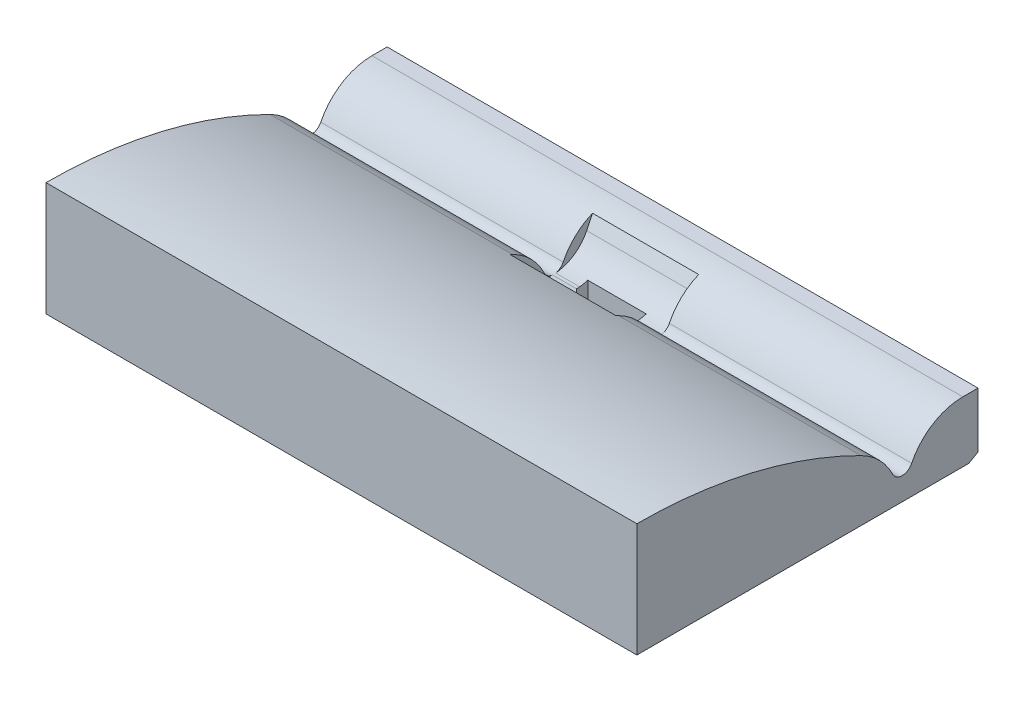
ISO-10303-21;
HEADER;
FILE_DESCRIPTION(('STEP AP214'),'2;1');
FILE_NAME('part.step','',(''),(''),'','','');
FILE_SCHEMA(('AUTOMOTIVE_DESIGN { 1 0 10303 214 1 1 1 1 }'));
ENDSEC;
DATA;
#1=APPLICATION_CONTEXT('core data for automotive mechanical design processes');
#2=APPLICATION_PROTOCOL_DEFINITION('international standard','automotive_design',2000,#1);
#3=PRODUCT_CONTEXT('',#1,'mechanical');
#4=PRODUCT('Part','Part','',(#3));
#5=PRODUCT_RELATED_PRODUCT_CATEGORY('part','',(#4));
#6=PRODUCT_DEFINITION_FORMATION('','',#4);
#7=PRODUCT_DEFINITION_CONTEXT('part definition',#1,'design');
#8=PRODUCT_DEFINITION('design','',#6,#7);
#9=PRODUCT_DEFINITION_SHAPE('','',#8);
#10=(LENGTH_UNIT() NAMED_UNIT(*) SI_UNIT(.MILLI.,.METRE.));
#11=(NAMED_UNIT(*) PLANE_ANGLE_UNIT() SI_UNIT($,.RADIAN.));
#12=(NAMED_UNIT(*) SI_UNIT($,.STERADIAN.) SOLID_ANGLE_UNIT());
#13=UNCERTAINTY_MEASURE_WITH_UNIT(LENGTH_MEASURE(1.E-05),#10,'distance_accuracy_value','');
#14=(GEOMETRIC_REPRESENTATION_CONTEXT(3) GLOBAL_UNCERTAINTY_ASSIGNED_CONTEXT((#13)) GLOBAL_UNIT_ASSIGNED_CONTEXT((#10,
#11,#12)) REPRESENTATION_CONTEXT('',''));
#15=CARTESIAN_POINT('',(0.,0.,0.));
#16=DIRECTION('',(0.,0.,1.));
#17=DIRECTION('',(1.,0.,0.));
#18=AXIS2_PLACEMENT_3D('',#15,#16,#17);
#19=CARTESIAN_POINT('',(38.9711431702997,52.2246829705794,19.5711631372731));
#20=DIRECTION('',(-1.,0.,0.));
#21=DIRECTION('',(0.,0.,1.));
#22=AXIS2_PLACEMENT_3D('',#19,#20,#21);
#23=CYLINDRICAL_SURFACE('',#22,9.25729399021629);
#24=CARTESIAN_POINT('',(7.,52.2246829705794,19.5711631372731));
#25=DIRECTION('',(-1.,0.,0.));
#26=DIRECTION('',(0.,0.,1.));
#27=AXIS2_PLACEMENT_3D('',#24,#25,#26);
#28=CIRCLE('',#27,9.25729399021629);
#29=CARTESIAN_POINT('',(7.,60.5,15.4218716213784));
#30=VERTEX_POINT('',#29);
#31=CARTESIAN_POINT('',(7.,56.28125,11.25));
#32=VERTEX_POINT('',#31);
#33=EDGE_CURVE('E261',#30,#32,#28,.T.);
#34=ORIENTED_EDGE('',*,*,#33,.F.);
#35=DIRECTION('',(-1.,0.,0.));
#36=VECTOR('',#35,1.);
#37=CARTESIAN_POINT('',(38.9711431702997,60.5,15.4218716213784));
#38=LINE('',#37,#36);
#39=CARTESIAN_POINT('',(38.9711431702997,60.5,15.4218716213784));
#40=VERTEX_POINT('',#39);
#41=EDGE_CURVE('E372',#40,#30,#38,.T.);
#42=ORIENTED_EDGE('',*,*,#41,.F.);
#43=CARTESIAN_POINT('',(38.9711431702997,52.2246829705794,19.5711631372731));
#44=DIRECTION('',(1.,0.,0.));
#45=DIRECTION('',(0.,0.,1.));
#46=AXIS2_PLACEMENT_3D('',#43,#44,#45);
#47=CIRCLE('',#46,9.25729399021629);
#48=CARTESIAN_POINT('',(38.9711431702997,56.28125,11.25));
#49=VERTEX_POINT('',#48);
#50=EDGE_CURVE('E353',#49,#40,#47,.T.);
#51=ORIENTED_EDGE('',*,*,#50,.F.);
#52=DIRECTION('',(-1.,0.,0.));
#53=VECTOR('',#52,1.);
#54=CARTESIAN_POINT('',(38.9711431702997,56.28125,11.25));
#55=LINE('',#54,#53);
#56=EDGE_CURVE('E376',#49,#32,#55,.T.);
#57=ORIENTED_EDGE('',*,*,#56,.T.);
#58=EDGE_LOOP('',(#34,#42,#51,#57));
#59=FACE_BOUND('',#58,.T.);
#60=ADVANCED_FACE('F37',(#59),#23,.T.);
#61=CARTESIAN_POINT('',(38.9711431702997,56.890625,10.));
#62=DIRECTION('',(-1.,0.,0.));
#63=DIRECTION('',(0.,0.,1.));
#64=AXIS2_PLACEMENT_3D('',#61,#62,#63);
#65=CYLINDRICAL_SURFACE('',#64,1.390625);
#66=CARTESIAN_POINT('',(7.,56.890625,10.));
#67=DIRECTION('',(-1.,0.,0.));
#68=DIRECTION('',(0.,0.,1.));
#69=AXIS2_PLACEMENT_3D('',#66,#67,#68);
#70=CIRCLE('',#69,1.390625);
#71=CARTESIAN_POINT('',(7.,55.5252776994791,9.73605940140772));
#72=VERTEX_POINT('',#71);
#73=CARTESIAN_POINT('',(7.,56.28125,8.75));
#74=VERTEX_POINT('',#73);
#75=EDGE_CURVE('E266',#72,#74,#70,.F.);
#76=ORIENTED_EDGE('',*,*,#75,.F.);
#77=DIRECTION('',(1.,0.,0.));
#78=VECTOR('',#77,1.);
#79=CARTESIAN_POINT('',(0.,55.5252776994791,9.73605940140772));
#80=LINE('',#79,#78);
#81=CARTESIAN_POINT('',(3.85,55.5252776994791,9.73605940140772));
#82=VERTEX_POINT('',#81);
#83=EDGE_CURVE('E246',#72,#82,#80,.F.);
#84=ORIENTED_EDGE('',*,*,#83,.T.);
#85=CARTESIAN_POINT('',(3.85,56.890625,10.));
#86=DIRECTION('',(1.,0.,0.));
#87=DIRECTION('',(0.,0.,-1.));
#88=AXIS2_PLACEMENT_3D('',#85,#86,#87);
#89=CIRCLE('',#88,1.390625);
#90=CARTESIAN_POINT('',(3.85,55.5081135567833,10.15));
#91=VERTEX_POINT('',#90);
#92=EDGE_CURVE('E290',#91,#82,#89,.T.);
#93=ORIENTED_EDGE('',*,*,#92,.F.);
#94=DIRECTION('',(1.,0.,0.));
#95=VECTOR('',#94,1.);
#96=CARTESIAN_POINT('',(0.,55.5081135567833,10.15));
#97=LINE('',#96,#95);
#98=CARTESIAN_POINT('',(7.,55.5081135567833,10.15));
#99=VERTEX_POINT('',#98);
#100=EDGE_CURVE('E258',#91,#99,#97,.T.);
#101=ORIENTED_EDGE('',*,*,#100,.T.);
#102=EDGE_CURVE('E263',#32,#99,#70,.F.);
#103=ORIENTED_EDGE('',*,*,#102,.F.);
#104=ORIENTED_EDGE('',*,*,#56,.F.);
#105=CARTESIAN_POINT('',(38.9711431702997,56.890625,10.));
#106=DIRECTION('',(-1.,0.,0.));
#107=DIRECTION('',(0.,0.,-1.));
#108=AXIS2_PLACEMENT_3D('',#105,#106,#107);
#109=CIRCLE('',#108,1.390625);
#110=CARTESIAN_POINT('',(38.9711431702997,56.28125,8.75));
#111=VERTEX_POINT('',#110);
#112=EDGE_CURVE('E351',#111,#49,#109,.T.);
#113=ORIENTED_EDGE('',*,*,#112,.F.);
#114=DIRECTION('',(-1.,0.,0.));
#115=VECTOR('',#114,1.);
#116=CARTESIAN_POINT('',(38.9711431702997,56.28125,8.75));
#117=LINE('',#116,#115);
#118=EDGE_CURVE('E380',#111,#74,#117,.T.);
#119=ORIENTED_EDGE('',*,*,#118,.T.);
#120=EDGE_LOOP('',(#76,#84,#93,#101,#103,#104,#113,#119));
#121=FACE_BOUND('',#120,.T.);
#122=ADVANCED_FACE('F456',(#121),#65,.F.);
#123=CARTESIAN_POINT('',(38.9711431702997,53.2,0.));
#124=DIRECTION('',(0.,0.,1.));
#125=DIRECTION('',(1.,0.,0.));
#126=AXIS2_PLACEMENT_3D('',#123,#124,#125);
#127=PLANE('',#126);
#128=DIRECTION('',(-1.,0.,0.));
#129=VECTOR('',#128,1.);
#130=CARTESIAN_POINT('',(38.9711431702997,53.2,0.));
#131=LINE('',#130,#129);
#132=CARTESIAN_POINT('',(38.9711431702997,53.2,0.));
#133=VERTEX_POINT('',#132);
#134=CARTESIAN_POINT('',(-38.9711431702997,53.2,0.));
#135=VERTEX_POINT('',#134);
#136=EDGE_CURVE('E363',#133,#135,#131,.T.);
#137=ORIENTED_EDGE('',*,*,#136,.T.);
#138=DIRECTION('',(0.,1.,0.));
#139=VECTOR('',#138,1.);
#140=CARTESIAN_POINT('',(-38.9711431702997,53.2,0.));
#141=LINE('',#140,#139);
#142=CARTESIAN_POINT('',(-38.9711431702997,60.5,0.));
#143=VERTEX_POINT('',#142);
#144=EDGE_CURVE('E317',#135,#143,#141,.T.);
#145=ORIENTED_EDGE('',*,*,#144,.T.);
#146=DIRECTION('',(-1.,0.,0.));
#147=VECTOR('',#146,1.);
#148=CARTESIAN_POINT('',(38.9711431702997,60.5,0.));
#149=LINE('',#148,#147);
#150=CARTESIAN_POINT('',(38.9711431702997,60.5,0.));
#151=VERTEX_POINT('',#150);
#152=EDGE_CURVE('E385',#151,#143,#149,.T.);
#153=ORIENTED_EDGE('',*,*,#152,.F.);
#154=DIRECTION('',(0.,1.,0.));
#155=VECTOR('',#154,1.);
#156=CARTESIAN_POINT('',(38.9711431702997,53.2,0.));
#157=LINE('',#156,#155);
#158=EDGE_CURVE('E344',#133,#151,#157,.T.);
#159=ORIENTED_EDGE('',*,*,#158,.F.);
#160=EDGE_LOOP('',(#137,#145,#153,#159));
#161=FACE_BOUND('',#160,.T.);
#162=ADVANCED_FACE('F39',(#161),#127,.F.);
#163=CARTESIAN_POINT('',(38.9711431702997,60.5,0.));
#164=DIRECTION('',(0.,-1.,0.));
#165=DIRECTION('',(0.,0.,-1.));
#166=AXIS2_PLACEMENT_3D('',#163,#164,#165);
#167=PLANE('',#166);
#168=ORIENTED_EDGE('',*,*,#152,.T.);
#169=DIRECTION('',(0.,0.,1.));
#170=VECTOR('',#169,1.);
#171=CARTESIAN_POINT('',(-38.9711431702997,60.5,0.));
#172=LINE('',#171,#170);
#173=CARTESIAN_POINT('',(-38.9711431702997,60.5,2.));
#174=VERTEX_POINT('',#173);
#175=EDGE_CURVE('E320',#143,#174,#172,.T.);
#176=ORIENTED_EDGE('',*,*,#175,.T.);
#177=DIRECTION('',(-1.,0.,0.));
#178=VECTOR('',#177,1.);
#179=CARTESIAN_POINT('',(38.9711431702997,60.5,2.));
#180=LINE('',#179,#178);
#181=CARTESIAN_POINT('',(38.9711431702997,60.5,2.));
#182=VERTEX_POINT('',#181);
#183=EDGE_CURVE('E383',#182,#174,#180,.T.);
#184=ORIENTED_EDGE('',*,*,#183,.F.);
#185=DIRECTION('',(0.,0.,1.));
#186=VECTOR('',#185,1.);
#187=CARTESIAN_POINT('',(38.9711431702997,60.5,0.));
#188=LINE('',#187,#186);
#189=EDGE_CURVE('E347',#151,#182,#188,.T.);
#190=ORIENTED_EDGE('',*,*,#189,.F.);
#191=EDGE_LOOP('',(#168,#176,#184,#190));
#192=FACE_BOUND('',#191,.T.);
#193=ADVANCED_FACE('F421',(#192),#167,.F.);
#194=CARTESIAN_POINT('',(38.9711431702997,52.990625,2.));
#195=DIRECTION('',(-1.,0.,0.));
#196=DIRECTION('',(0.,0.,1.));
#197=AXIS2_PLACEMENT_3D('',#194,#195,#196);
#198=CYLINDRICAL_SURFACE('',#197,7.509375);
#199=CARTESIAN_POINT('',(-7.,56.28125,8.75));
#200=VERTEX_POINT('',#199);
#201=CARTESIAN_POINT('',(-38.9711431702997,56.28125,8.75));
#202=VERTEX_POINT('',#201);
#203=EDGE_CURVE('E379',#200,#202,#117,.T.);
#204=ORIENTED_EDGE('',*,*,#203,.F.);
#205=CARTESIAN_POINT('',(-7.,52.990625,2.));
#206=DIRECTION('',(-1.,0.,0.));
#207=DIRECTION('',(0.,0.,1.));
#208=AXIS2_PLACEMENT_3D('',#205,#206,#207);
#209=CIRCLE('',#208,7.509375);
#210=CARTESIAN_POINT('',(-7.,59.9276013910904,4.87559931841684));
#211=VERTEX_POINT('',#210);
#212=EDGE_CURVE('E274',#200,#211,#209,.T.);
#213=ORIENTED_EDGE('',*,*,#212,.T.);
#214=DIRECTION('',(-1.,0.,0.));
#215=VECTOR('',#214,1.);
#216=CARTESIAN_POINT('',(38.9711431702997,59.9276013910904,4.87559931841684));
#217=LINE('',#216,#215);
#218=CARTESIAN_POINT('',(7.,59.9276013910904,4.87559931841684));
#219=VERTEX_POINT('',#218);
#220=EDGE_CURVE('E11',#211,#219,#217,.F.);
#221=ORIENTED_EDGE('',*,*,#220,.T.);
#222=CARTESIAN_POINT('',(7.,52.990625,2.));
#223=DIRECTION('',(-1.,0.,0.));
#224=DIRECTION('',(0.,0.,1.));
#225=AXIS2_PLACEMENT_3D('',#222,#223,#224);
#226=CIRCLE('',#225,7.509375);
#227=EDGE_CURVE('E265',#74,#219,#226,.T.);
#228=ORIENTED_EDGE('',*,*,#227,.F.);
#229=ORIENTED_EDGE('',*,*,#118,.F.);
#230=CARTESIAN_POINT('',(38.9711431702997,52.990625,2.));
#231=DIRECTION('',(1.,0.,0.));
#232=DIRECTION('',(0.,0.,1.));
#233=AXIS2_PLACEMENT_3D('',#230,#231,#232);
#234=CIRCLE('',#233,7.509375);
#235=EDGE_CURVE('E349',#182,#111,#234,.T.);
#236=ORIENTED_EDGE('',*,*,#235,.F.);
#237=ORIENTED_EDGE('',*,*,#183,.T.);
#238=CARTESIAN_POINT('',(-38.9711431702997,52.990625,2.));
#239=DIRECTION('',(1.,0.,0.));
#240=DIRECTION('',(0.,0.,1.));
#241=AXIS2_PLACEMENT_3D('',#238,#239,#240);
#242=CIRCLE('',#241,7.509375);
#243=EDGE_CURVE('E323',#174,#202,#242,.T.);
#244=ORIENTED_EDGE('',*,*,#243,.T.);
#245=EDGE_LOOP('',(#204,#213,#221,#228,#229,#236,#237,#244));
#246=FACE_BOUND('',#245,.T.);
#247=ADVANCED_FACE('F416',(#246),#198,.T.);
#248=CARTESIAN_POINT('',(-3.85,56.890625,10.));
#249=DIRECTION('',(-1.,0.,0.));
#250=DIRECTION('',(0.,0.,1.));
#251=AXIS2_PLACEMENT_3D('',#248,#249,#250);
#252=CIRCLE('',#251,1.390625);
#253=CARTESIAN_POINT('',(-3.85,55.5252776994791,9.73605940140772));
#254=VERTEX_POINT('',#253);
#255=CARTESIAN_POINT('',(-3.85,55.5081135567833,10.15));
#256=VERTEX_POINT('',#255);
#257=EDGE_CURVE('E314',#254,#256,#252,.T.);
#258=ORIENTED_EDGE('',*,*,#257,.F.);
#259=DIRECTION('',(1.,0.,0.));
#260=VECTOR('',#259,1.);
#261=CARTESIAN_POINT('',(0.,55.5252776994791,9.73605940140772));
#262=LINE('',#261,#260);
#263=CARTESIAN_POINT('',(-7.,55.5252776994791,9.73605940140772));
#264=VERTEX_POINT('',#263);
#265=EDGE_CURVE('E244',#254,#264,#262,.F.);
#266=ORIENTED_EDGE('',*,*,#265,.T.);
#267=CARTESIAN_POINT('',(-7.,56.890625,10.));
#268=DIRECTION('',(-1.,0.,0.));
#269=DIRECTION('',(0.,0.,1.));
#270=AXIS2_PLACEMENT_3D('',#267,#268,#269);
#271=CIRCLE('',#270,1.390625);
#272=EDGE_CURVE('E211',#264,#200,#271,.F.);
#273=ORIENTED_EDGE('',*,*,#272,.T.);
#274=ORIENTED_EDGE('',*,*,#203,.T.);
#275=CARTESIAN_POINT('',(-38.9711431702997,56.890625,10.));
#276=DIRECTION('',(-1.,0.,0.));
#277=DIRECTION('',(0.,0.,-1.));
#278=AXIS2_PLACEMENT_3D('',#275,#276,#277);
#279=CIRCLE('',#278,1.390625);
#280=CARTESIAN_POINT('',(-38.9711431702997,56.28125,11.25));
#281=VERTEX_POINT('',#280);
#282=EDGE_CURVE('E326',#202,#281,#279,.T.);
#283=ORIENTED_EDGE('',*,*,#282,.T.);
#284=CARTESIAN_POINT('',(-7.,56.28125,11.25));
#285=VERTEX_POINT('',#284);
#286=EDGE_CURVE('E375',#285,#281,#55,.T.);
#287=ORIENTED_EDGE('',*,*,#286,.F.);
#288=CARTESIAN_POINT('',(-7.,55.5081135567833,10.15));
#289=VERTEX_POINT('',#288);
#290=EDGE_CURVE('E271',#285,#289,#271,.F.);
#291=ORIENTED_EDGE('',*,*,#290,.T.);
#292=DIRECTION('',(1.,0.,0.));
#293=VECTOR('',#292,1.);
#294=CARTESIAN_POINT('',(0.,55.5081135567833,10.15));
#295=LINE('',#294,#293);
#296=EDGE_CURVE('E255',#289,#256,#295,.T.);
#297=ORIENTED_EDGE('',*,*,#296,.T.);
#298=EDGE_LOOP('',(#258,#266,#273,#274,#283,#287,#291,#297));
#299=FACE_BOUND('',#298,.T.);
#300=ADVANCED_FACE('F413',(#299),#65,.F.);
#301=CARTESIAN_POINT('',(-7.,60.5,15.4218716213784));
#302=VERTEX_POINT('',#301);
#303=CARTESIAN_POINT('',(-38.9711431702997,60.5,15.4218716213784));
#304=VERTEX_POINT('',#303);
#305=EDGE_CURVE('E371',#302,#304,#38,.T.);
#306=ORIENTED_EDGE('',*,*,#305,.F.);
#307=CARTESIAN_POINT('',(-7.,52.2246829705794,19.5711631372731));
#308=DIRECTION('',(-1.,0.,0.));
#309=DIRECTION('',(0.,0.,1.));
#310=AXIS2_PLACEMENT_3D('',#307,#308,#309);
#311=CIRCLE('',#310,9.25729399021629);
#312=EDGE_CURVE('E268',#302,#285,#311,.T.);
#313=ORIENTED_EDGE('',*,*,#312,.T.);
#314=ORIENTED_EDGE('',*,*,#286,.T.);
#315=CARTESIAN_POINT('',(-38.9711431702997,52.2246829705794,19.5711631372731));
#316=DIRECTION('',(1.,0.,0.));
#317=DIRECTION('',(0.,0.,1.));
#318=AXIS2_PLACEMENT_3D('',#315,#316,#317);
#319=CIRCLE('',#318,9.25729399021629);
#320=EDGE_CURVE('E329',#281,#304,#319,.T.);
#321=ORIENTED_EDGE('',*,*,#320,.T.);
#322=EDGE_LOOP('',(#306,#313,#314,#321));
#323=FACE_BOUND('',#322,.T.);
#324=ADVANCED_FACE('F402',(#323),#23,.T.);
#325=CARTESIAN_POINT('',(38.9711431702997,1.50959440127008,45.));
#326=DIRECTION('',(-1.,0.,0.));
#327=DIRECTION('',(0.,0.,1.));
#328=AXIS2_PLACEMENT_3D('',#325,#326,#327);
#329=CYLINDRICAL_SURFACE('',#328,65.99040559873);
#330=DIRECTION('',(-1.,0.,0.));
#331=VECTOR('',#330,1.);
#332=CARTESIAN_POINT('',(38.9711431702997,60.683362123709,15.7904323103588));
#333=LINE('',#332,#331);
#334=CARTESIAN_POINT('',(7.,60.6833621237091,15.7904323103588));
#335=VERTEX_POINT('',#334);
#336=CARTESIAN_POINT('',(-7.,60.6833621237091,15.7904323103588));
#337=VERTEX_POINT('',#336);
#338=EDGE_CURVE('E391',#335,#337,#333,.T.);
#339=ORIENTED_EDGE('',*,*,#338,.T.);
#340=CARTESIAN_POINT('',(-7.,1.50959440127008,45.));
#341=DIRECTION('',(-1.,0.,0.));
#342=DIRECTION('',(0.,0.,1.));
#343=AXIS2_PLACEMENT_3D('',#340,#341,#342);
#344=CIRCLE('',#343,65.99040559873);
#345=EDGE_CURVE('E45',#337,#302,#344,.T.);
#346=ORIENTED_EDGE('',*,*,#345,.T.);
#347=ORIENTED_EDGE('',*,*,#305,.T.);
#348=CARTESIAN_POINT('',(-38.9711431702997,1.50959440127008,45.));
#349=DIRECTION('',(1.,0.,0.));
#350=DIRECTION('',(0.,0.,-1.));
#351=AXIS2_PLACEMENT_3D('',#348,#349,#350);
#352=CIRCLE('',#351,65.99040559873);
#353=CARTESIAN_POINT('',(-38.9711431702997,67.5,45.));
#354=VERTEX_POINT('',#353);
#355=EDGE_CURVE('E332',#304,#354,#352,.T.);
#356=ORIENTED_EDGE('',*,*,#355,.T.);
#357=DIRECTION('',(-1.,0.,0.));
#358=VECTOR('',#357,1.);
#359=CARTESIAN_POINT('',(38.9711431702997,67.5,45.));
#360=LINE('',#359,#358);
#361=CARTESIAN_POINT('',(38.9711431702997,67.5,45.));
#362=VERTEX_POINT('',#361);
#363=EDGE_CURVE('E369',#362,#354,#360,.T.);
#364=ORIENTED_EDGE('',*,*,#363,.F.);
#365=CARTESIAN_POINT('',(38.9711431702997,1.50959440127008,45.));
#366=DIRECTION('',(1.,0.,0.));
#367=DIRECTION('',(0.,0.,-1.));
#368=AXIS2_PLACEMENT_3D('',#365,#366,#367);
#369=CIRCLE('',#368,65.99040559873);
#370=EDGE_CURVE('E355',#40,#362,#369,.T.);
#371=ORIENTED_EDGE('',*,*,#370,.F.);
#372=ORIENTED_EDGE('',*,*,#41,.T.);
#373=CARTESIAN_POINT('',(7.,1.50959440127008,45.));
#374=DIRECTION('',(-1.,0.,0.));
#375=DIRECTION('',(0.,0.,1.));
#376=AXIS2_PLACEMENT_3D('',#373,#374,#375);
#377=CIRCLE('',#376,65.99040559873);
#378=EDGE_CURVE('E389',#335,#30,#377,.T.);
#379=ORIENTED_EDGE('',*,*,#378,.F.);
#380=EDGE_LOOP('',(#339,#346,#347,#356,#364,#371,#372,#379));
#381=FACE_BOUND('',#380,.T.);
#382=ADVANCED_FACE('F396',(#381),#329,.T.);
#383=CARTESIAN_POINT('',(38.9711431702997,67.5,45.));
#384=DIRECTION('',(0.,0.,-1.));
#385=DIRECTION('',(-1.,0.,0.));
#386=AXIS2_PLACEMENT_3D('',#383,#384,#385);
#387=PLANE('',#386);
#388=ORIENTED_EDGE('',*,*,#363,.T.);
#389=DIRECTION('',(0.,-1.,0.));
#390=VECTOR('',#389,1.);
#391=CARTESIAN_POINT('',(-38.9711431702997,67.5,45.));
#392=LINE('',#391,#390);
#393=CARTESIAN_POINT('',(-38.9711431702997,52.5,45.));
#394=VERTEX_POINT('',#393);
#395=EDGE_CURVE('E335',#354,#394,#392,.T.);
#396=ORIENTED_EDGE('',*,*,#395,.T.);
#397=DIRECTION('',(-1.,0.,0.));
#398=VECTOR('',#397,1.);
#399=CARTESIAN_POINT('',(38.9711431702997,52.5,45.));
#400=LINE('',#399,#398);
#401=CARTESIAN_POINT('',(38.9711431702997,52.5,45.));
#402=VERTEX_POINT('',#401);
#403=EDGE_CURVE('E367',#402,#394,#400,.T.);
#404=ORIENTED_EDGE('',*,*,#403,.F.);
#405=DIRECTION('',(0.,-1.,0.));
#406=VECTOR('',#405,1.);
#407=CARTESIAN_POINT('',(38.9711431702997,67.5,45.));
#408=LINE('',#407,#406);
#409=EDGE_CURVE('E357',#362,#402,#408,.T.);
#410=ORIENTED_EDGE('',*,*,#409,.F.);
#411=EDGE_LOOP('',(#388,#396,#404,#410));
#412=FACE_BOUND('',#411,.T.);
#413=ADVANCED_FACE('F437',(#412),#387,.F.);
#414=CARTESIAN_POINT('',(38.9711431702997,52.5,1.2124355652982));
#415=DIRECTION('',(0.,1.,0.));
#416=DIRECTION('',(0.,0.,1.));
#417=AXIS2_PLACEMENT_3D('',#414,#415,#416);
#418=PLANE('',#417);
#419=DIRECTION('',(-0.707106781186548,0.,0.707106781186547));
#420=VECTOR('',#419,1.);
#421=CARTESIAN_POINT('',(3.85,52.5,10.15));
#422=LINE('',#421,#420);
#423=CARTESIAN_POINT('',(3.85,52.5,10.15));
#424=VERTEX_POINT('',#423);
#425=CARTESIAN_POINT('',(2.65,52.5,11.35));
#426=VERTEX_POINT('',#425);
#427=EDGE_CURVE('E284',#424,#426,#422,.T.);
#428=ORIENTED_EDGE('',*,*,#427,.F.);
#429=DIRECTION('',(0.,0.,1.));
#430=VECTOR('',#429,1.);
#431=CARTESIAN_POINT('',(3.85,52.5,8.65000000000001));
#432=LINE('',#431,#430);
#433=CARTESIAN_POINT('',(3.85,52.5,8.65000000000001));
#434=VERTEX_POINT('',#433);
#435=EDGE_CURVE('E287',#434,#424,#432,.T.);
#436=ORIENTED_EDGE('',*,*,#435,.F.);
#437=DIRECTION('',(1.,0.,0.));
#438=VECTOR('',#437,1.);
#439=CARTESIAN_POINT('',(3.85,52.5,8.65000000000001));
#440=LINE('',#439,#438);
#441=CARTESIAN_POINT('',(-3.85,52.5,8.65000000000001));
#442=VERTEX_POINT('',#441);
#443=EDGE_CURVE('E297',#442,#434,#440,.T.);
#444=ORIENTED_EDGE('',*,*,#443,.F.);
#445=DIRECTION('',(0.,0.,-1.));
#446=VECTOR('',#445,1.);
#447=CARTESIAN_POINT('',(-3.85,52.5,8.65000000000001));
#448=LINE('',#447,#446);
#449=CARTESIAN_POINT('',(-3.85,52.5,10.15));
#450=VERTEX_POINT('',#449);
#451=EDGE_CURVE('E276',#450,#442,#448,.T.);
#452=ORIENTED_EDGE('',*,*,#451,.F.);
#453=DIRECTION('',(-0.707106781186549,0.,-0.707106781186546));
#454=VECTOR('',#453,1.);
#455=CARTESIAN_POINT('',(-2.65,52.5,11.35));
#456=LINE('',#455,#454);
#457=CARTESIAN_POINT('',(-2.65,52.5,11.35));
#458=VERTEX_POINT('',#457);
#459=EDGE_CURVE('E278',#458,#450,#456,.T.);
#460=ORIENTED_EDGE('',*,*,#459,.F.);
#461=DIRECTION('',(-1.,0.,0.));
#462=VECTOR('',#461,1.);
#463=CARTESIAN_POINT('',(2.65,52.5,11.35));
#464=LINE('',#463,#462);
#465=EDGE_CURVE('E281',#426,#458,#464,.T.);
#466=ORIENTED_EDGE('',*,*,#465,.F.);
#467=EDGE_LOOP('',(#428,#436,#444,#452,#460,#466));
#468=FACE_BOUND('',#467,.T.);
#469=ORIENTED_EDGE('',*,*,#403,.T.);
#470=DIRECTION('',(0.,0.,-1.));
#471=VECTOR('',#470,1.);
#472=CARTESIAN_POINT('',(-38.9711431702997,52.5,1.2124355652982));
#473=LINE('',#472,#471);
#474=CARTESIAN_POINT('',(-38.9711431702997,52.5,1.2124355652982));
#475=VERTEX_POINT('',#474);
#476=EDGE_CURVE('E338',#394,#475,#473,.T.);
#477=ORIENTED_EDGE('',*,*,#476,.T.);
#478=DIRECTION('',(-1.,0.,0.));
#479=VECTOR('',#478,1.);
#480=CARTESIAN_POINT('',(38.9711431702997,52.5,1.2124355652982));
#481=LINE('',#480,#479);
#482=CARTESIAN_POINT('',(38.9711431702997,52.5,1.2124355652982));
#483=VERTEX_POINT('',#482);
#484=EDGE_CURVE('E365',#483,#475,#481,.T.);
#485=ORIENTED_EDGE('',*,*,#484,.F.);
#486=DIRECTION('',(0.,0.,-1.));
#487=VECTOR('',#486,1.);
#488=CARTESIAN_POINT('',(38.9711431702997,52.5,1.2124355652982));
#489=LINE('',#488,#487);
#490=EDGE_CURVE('E359',#402,#483,#489,.T.);
#491=ORIENTED_EDGE('',*,*,#490,.F.);
#492=EDGE_LOOP('',(#469,#477,#485,#491));
#493=FACE_BOUND('',#492,.T.);
#494=ADVANCED_FACE('F434',(#468,#493),#418,.F.);
#495=CARTESIAN_POINT('',(38.9711431702997,53.2,0.));
#496=DIRECTION('',(0.,0.866025403784436,0.500000000000004));
#497=DIRECTION('',(0.,-0.500000000000004,0.866025403784436));
#498=AXIS2_PLACEMENT_3D('',#495,#496,#497);
#499=PLANE('',#498);
#500=ORIENTED_EDGE('',*,*,#484,.T.);
#501=DIRECTION('',(0.,0.500000000000004,-0.866025403784436));
#502=VECTOR('',#501,1.);
#503=CARTESIAN_POINT('',(-38.9711431702997,53.2,0.));
#504=LINE('',#503,#502);
#505=EDGE_CURVE('E341',#475,#135,#504,.T.);
#506=ORIENTED_EDGE('',*,*,#505,.T.);
#507=ORIENTED_EDGE('',*,*,#136,.F.);
#508=DIRECTION('',(0.,0.500000000000004,-0.866025403784436));
#509=VECTOR('',#508,1.);
#510=CARTESIAN_POINT('',(38.9711431702997,53.2,0.));
#511=LINE('',#510,#509);
#512=EDGE_CURVE('E361',#483,#133,#511,.T.);
#513=ORIENTED_EDGE('',*,*,#512,.F.);
#514=EDGE_LOOP('',(#500,#506,#507,#513));
#515=FACE_BOUND('',#514,.T.);
#516=ADVANCED_FACE('F429',(#515),#499,.F.);
#517=CARTESIAN_POINT('',(38.9711431702997,52.990625,2.));
#518=DIRECTION('',(-1.,0.,0.));
#519=DIRECTION('',(0.,0.,1.));
#520=AXIS2_PLACEMENT_3D('',#517,#518,#519);
#521=PLANE('',#520);
#522=ORIENTED_EDGE('',*,*,#158,.T.);
#523=ORIENTED_EDGE('',*,*,#189,.T.);
#524=ORIENTED_EDGE('',*,*,#235,.T.);
#525=ORIENTED_EDGE('',*,*,#112,.T.);
#526=ORIENTED_EDGE('',*,*,#50,.T.);
#527=ORIENTED_EDGE('',*,*,#370,.T.);
#528=ORIENTED_EDGE('',*,*,#409,.T.);
#529=ORIENTED_EDGE('',*,*,#490,.T.);
#530=ORIENTED_EDGE('',*,*,#512,.T.);
#531=EDGE_LOOP('',(#522,#523,#524,#525,#526,#527,#528,#529,#530));
#532=FACE_BOUND('',#531,.T.);
#533=ADVANCED_FACE('F443',(#532),#521,.F.);
#534=CARTESIAN_POINT('',(-38.9711431702997,52.990625,2.));
#535=DIRECTION('',(-1.,0.,0.));
#536=DIRECTION('',(0.,0.,1.));
#537=AXIS2_PLACEMENT_3D('',#534,#535,#536);
#538=PLANE('',#537);
#539=ORIENTED_EDGE('',*,*,#144,.F.);
#540=ORIENTED_EDGE('',*,*,#505,.F.);
#541=ORIENTED_EDGE('',*,*,#476,.F.);
#542=ORIENTED_EDGE('',*,*,#395,.F.);
#543=ORIENTED_EDGE('',*,*,#355,.F.);
#544=ORIENTED_EDGE('',*,*,#320,.F.);
#545=ORIENTED_EDGE('',*,*,#282,.F.);
#546=ORIENTED_EDGE('',*,*,#243,.F.);
#547=ORIENTED_EDGE('',*,*,#175,.F.);
#548=EDGE_LOOP('',(#539,#540,#541,#542,#543,#544,#545,#546,#547));
#549=FACE_BOUND('',#548,.T.);
#550=ADVANCED_FACE('F408',(#549),#538,.T.);
#551=CARTESIAN_POINT('',(3.85,52.499,8.65000000000001));
#552=DIRECTION('',(1.,0.,0.));
#553=DIRECTION('',(0.,0.,-1.));
#554=AXIS2_PLACEMENT_3D('',#551,#552,#553);
#555=PLANE('',#554);
#556=ORIENTED_EDGE('',*,*,#92,.T.);
#557=CARTESIAN_POINT('',(3.85,60.5081135567833,10.15));
#558=DIRECTION('',(1.,0.,0.));
#559=DIRECTION('',(0.,0.,-1.));
#560=AXIS2_PLACEMENT_3D('',#557,#558,#559);
#561=CIRCLE('',#560,5.);
#562=CARTESIAN_POINT('',(3.85,55.7384175496986,8.65000000000001));
#563=VERTEX_POINT('',#562);
#564=EDGE_CURVE('E241',#82,#563,#561,.T.);
#565=ORIENTED_EDGE('',*,*,#564,.T.);
#566=DIRECTION('',(0.,1.,0.));
#567=VECTOR('',#566,1.);
#568=CARTESIAN_POINT('',(3.85,52.499,8.65000000000001));
#569=LINE('',#568,#567);
#570=EDGE_CURVE('E293',#434,#563,#569,.T.);
#571=ORIENTED_EDGE('',*,*,#570,.F.);
#572=ORIENTED_EDGE('',*,*,#435,.T.);
#573=DIRECTION('',(0.,1.,0.));
#574=VECTOR('',#573,1.);
#575=CARTESIAN_POINT('',(3.85,52.499,10.15));
#576=LINE('',#575,#574);
#577=EDGE_CURVE('E294',#424,#91,#576,.T.);
#578=ORIENTED_EDGE('',*,*,#577,.T.);
#579=EDGE_LOOP('',(#556,#565,#571,#572,#578));
#580=FACE_BOUND('',#579,.T.);
#581=ADVANCED_FACE('F462',(#580),#555,.F.);
#582=CARTESIAN_POINT('',(3.85,52.499,10.15));
#583=DIRECTION('',(0.707106781186547,0.,0.707106781186548));
#584=DIRECTION('',(0.707106781186548,0.,-0.707106781186547));
#585=AXIS2_PLACEMENT_3D('',#582,#583,#584);
#586=PLANE('',#585);
#587=DIRECTION('',(0.,1.,0.));
#588=VECTOR('',#587,1.);
#589=CARTESIAN_POINT('',(2.65,52.499,11.35));
#590=LINE('',#589,#588);
#591=CARTESIAN_POINT('',(2.65,55.6542491169787,11.35));
#592=VERTEX_POINT('',#591);
#593=EDGE_CURVE('E298',#426,#592,#590,.T.);
#594=ORIENTED_EDGE('',*,*,#593,.T.);
#595=CARTESIAN_POINT('',(3.85,60.5081135567833,10.15));
#596=DIRECTION('',(0.707106781186547,0.,0.707106781186548));
#597=DIRECTION('',(0.707106781186548,0.,-0.707106781186547));
#598=AXIS2_PLACEMENT_3D('',#595,#596,#597);
#599=ELLIPSE('',#598,7.07106781186548,5.);
#600=EDGE_CURVE('E252',#592,#91,#599,.T.);
#601=ORIENTED_EDGE('',*,*,#600,.T.);
#602=ORIENTED_EDGE('',*,*,#577,.F.);
#603=ORIENTED_EDGE('',*,*,#427,.T.);
#604=EDGE_LOOP('',(#594,#601,#602,#603));
#605=FACE_BOUND('',#604,.T.);
#606=ADVANCED_FACE('F460',(#605),#586,.F.);
#607=CARTESIAN_POINT('',(2.65,52.499,11.35));
#608=DIRECTION('',(0.,0.,1.));
#609=DIRECTION('',(1.,0.,0.));
#610=AXIS2_PLACEMENT_3D('',#607,#608,#609);
#611=PLANE('',#610);
#612=DIRECTION('',(0.,1.,0.));
#613=VECTOR('',#612,1.);
#614=CARTESIAN_POINT('',(-2.65,52.499,11.35));
#615=LINE('',#614,#613);
#616=CARTESIAN_POINT('',(-2.65,55.6542491169787,11.35));
#617=VERTEX_POINT('',#616);
#618=EDGE_CURVE('E301',#458,#617,#615,.T.);
#619=ORIENTED_EDGE('',*,*,#618,.T.);
#620=DIRECTION('',(1.,0.,0.));
#621=VECTOR('',#620,1.);
#622=CARTESIAN_POINT('',(-7.,55.6542491169787,11.35));
#623=LINE('',#622,#621);
#624=EDGE_CURVE('E52',#617,#592,#623,.T.);
#625=ORIENTED_EDGE('',*,*,#624,.T.);
#626=ORIENTED_EDGE('',*,*,#593,.F.);
#627=ORIENTED_EDGE('',*,*,#465,.T.);
#628=EDGE_LOOP('',(#619,#625,#626,#627));
#629=FACE_BOUND('',#628,.T.);
#630=ADVANCED_FACE('F471',(#629),#611,.F.);
#631=CARTESIAN_POINT('',(-2.65,52.499,11.35));
#632=DIRECTION('',(-0.707106781186546,0.,0.707106781186549));
#633=DIRECTION('',(0.707106781186549,0.,0.707106781186546));
#634=AXIS2_PLACEMENT_3D('',#631,#632,#633);
#635=PLANE('',#634);
#636=DIRECTION('',(0.,1.,0.));
#637=VECTOR('',#636,1.);
#638=CARTESIAN_POINT('',(-3.85,52.499,10.15));
#639=LINE('',#638,#637);
#640=EDGE_CURVE('E304',#450,#256,#639,.T.);
#641=ORIENTED_EDGE('',*,*,#640,.T.);
#642=CARTESIAN_POINT('',(-3.85,60.5081135567833,10.15));
#643=DIRECTION('',(-0.707106781186546,0.,0.707106781186549));
#644=DIRECTION('',(0.707106781186549,0.,0.707106781186546));
#645=AXIS2_PLACEMENT_3D('',#642,#643,#644);
#646=ELLIPSE('',#645,7.07106781186549,5.);
#647=EDGE_CURVE('E249',#256,#617,#646,.T.);
#648=ORIENTED_EDGE('',*,*,#647,.T.);
#649=ORIENTED_EDGE('',*,*,#618,.F.);
#650=ORIENTED_EDGE('',*,*,#459,.T.);
#651=EDGE_LOOP('',(#641,#648,#649,#650));
#652=FACE_BOUND('',#651,.T.);
#653=ADVANCED_FACE('F473',(#652),#635,.F.);
#654=CARTESIAN_POINT('',(-3.85,52.499,8.65000000000001));
#655=DIRECTION('',(-1.,0.,0.));
#656=DIRECTION('',(0.,0.,1.));
#657=AXIS2_PLACEMENT_3D('',#654,#655,#656);
#658=PLANE('',#657);
#659=DIRECTION('',(0.,1.,0.));
#660=VECTOR('',#659,1.);
#661=CARTESIAN_POINT('',(-3.85,52.499,8.65000000000001));
#662=LINE('',#661,#660);
#663=CARTESIAN_POINT('',(-3.85,55.7384175496986,8.65000000000001));
#664=VERTEX_POINT('',#663);
#665=EDGE_CURVE('E307',#442,#664,#662,.T.);
#666=ORIENTED_EDGE('',*,*,#665,.T.);
#667=CARTESIAN_POINT('',(-3.85,60.5081135567833,10.15));
#668=DIRECTION('',(-1.,0.,0.));
#669=DIRECTION('',(0.,0.,1.));
#670=AXIS2_PLACEMENT_3D('',#667,#668,#669);
#671=CIRCLE('',#670,5.);
#672=EDGE_CURVE('E60',#664,#254,#671,.T.);
#673=ORIENTED_EDGE('',*,*,#672,.T.);
#674=ORIENTED_EDGE('',*,*,#257,.T.);
#675=ORIENTED_EDGE('',*,*,#640,.F.);
#676=ORIENTED_EDGE('',*,*,#451,.T.);
#677=EDGE_LOOP('',(#666,#673,#674,#675,#676));
#678=FACE_BOUND('',#677,.T.);
#679=ADVANCED_FACE('F476',(#678),#658,.F.);
#680=CARTESIAN_POINT('',(3.85,52.499,8.65000000000001));
#681=DIRECTION('',(0.,0.,-1.));
#682=DIRECTION('',(-1.,0.,0.));
#683=AXIS2_PLACEMENT_3D('',#680,#681,#682);
#684=PLANE('',#683);
#685=ORIENTED_EDGE('',*,*,#570,.T.);
#686=DIRECTION('',(1.,0.,0.));
#687=VECTOR('',#686,1.);
#688=CARTESIAN_POINT('',(-7.,55.7384175496986,8.65000000000001));
#689=LINE('',#688,#687);
#690=EDGE_CURVE('E387',#563,#664,#689,.F.);
#691=ORIENTED_EDGE('',*,*,#690,.T.);
#692=ORIENTED_EDGE('',*,*,#665,.F.);
#693=ORIENTED_EDGE('',*,*,#443,.T.);
#694=EDGE_LOOP('',(#685,#691,#692,#693));
#695=FACE_BOUND('',#694,.T.);
#696=ADVANCED_FACE('F479',(#695),#684,.F.);
#697=CARTESIAN_POINT('',(-7.,60.5081135567833,10.15));
#698=DIRECTION('',(1.,0.,0.));
#699=DIRECTION('',(0.,0.,-1.));
#700=AXIS2_PLACEMENT_3D('',#697,#698,#699);
#701=CYLINDRICAL_SURFACE('',#700,5.);
#702=CARTESIAN_POINT('',(7.,60.5081135567833,10.15));
#703=DIRECTION('',(1.,0.,0.));
#704=DIRECTION('',(0.,0.,1.));
#705=AXIS2_PLACEMENT_3D('',#702,#703,#704);
#706=CIRCLE('',#705,5.);
#707=CARTESIAN_POINT('',(7.,58.328664085013,5.65000000000001));
#708=VERTEX_POINT('',#707);
#709=EDGE_CURVE('E220',#72,#708,#706,.T.);
#710=ORIENTED_EDGE('',*,*,#709,.T.);
#711=DIRECTION('',(1.,0.,0.));
#712=VECTOR('',#711,1.);
#713=CARTESIAN_POINT('',(-7.,58.328664085013,5.65000000000001));
#714=LINE('',#713,#712);
#715=CARTESIAN_POINT('',(-7.,58.328664085013,5.65000000000001));
#716=VERTEX_POINT('',#715);
#717=EDGE_CURVE('E217',#716,#708,#714,.T.);
#718=ORIENTED_EDGE('',*,*,#717,.F.);
#719=CARTESIAN_POINT('',(-7.,60.5081135567833,10.15));
#720=DIRECTION('',(1.,0.,0.));
#721=DIRECTION('',(0.,0.,1.));
#722=AXIS2_PLACEMENT_3D('',#719,#720,#721);
#723=CIRCLE('',#722,5.);
#724=EDGE_CURVE('E204',#264,#716,#723,.T.);
#725=ORIENTED_EDGE('',*,*,#724,.F.);
#726=ORIENTED_EDGE('',*,*,#265,.F.);
#727=ORIENTED_EDGE('',*,*,#672,.F.);
#728=ORIENTED_EDGE('',*,*,#690,.F.);
#729=ORIENTED_EDGE('',*,*,#564,.F.);
#730=ORIENTED_EDGE('',*,*,#83,.F.);
#731=EDGE_LOOP('',(#710,#718,#725,#726,#727,#728,#729,#730));
#732=FACE_BOUND('',#731,.T.);
#733=ADVANCED_FACE('F218',(#732),#701,.F.);
#734=CARTESIAN_POINT('',(-7.,60.5081135567833,10.15));
#735=DIRECTION('',(-1.,0.,0.));
#736=DIRECTION('',(0.,0.,1.));
#737=AXIS2_PLACEMENT_3D('',#734,#735,#736);
#738=PLANE('',#737);
#739=ORIENTED_EDGE('',*,*,#272,.F.);
#740=ORIENTED_EDGE('',*,*,#724,.T.);
#741=DIRECTION('',(0.,0.900000000000001,-0.435889894354065));
#742=VECTOR('',#741,1.);
#743=CARTESIAN_POINT('',(-7.,58.328664085013,5.65000000000001));
#744=LINE('',#743,#742);
#745=EDGE_CURVE('E208',#716,#211,#744,.T.);
#746=ORIENTED_EDGE('',*,*,#745,.T.);
#747=ORIENTED_EDGE('',*,*,#212,.F.);
#748=EDGE_LOOP('',(#739,#740,#746,#747));
#749=FACE_BOUND('',#748,.T.);
#750=ADVANCED_FACE('F206',(#749),#738,.F.);
#751=CARTESIAN_POINT('',(7.,60.5081135567833,10.15));
#752=DIRECTION('',(-1.,0.,0.));
#753=DIRECTION('',(0.,0.,1.));
#754=AXIS2_PLACEMENT_3D('',#751,#752,#753);
#755=PLANE('',#754);
#756=ORIENTED_EDGE('',*,*,#75,.T.);
#757=ORIENTED_EDGE('',*,*,#227,.T.);
#758=DIRECTION('',(0.,0.900000000000001,-0.435889894354065));
#759=VECTOR('',#758,1.);
#760=CARTESIAN_POINT('',(7.,58.328664085013,5.65000000000001));
#761=LINE('',#760,#759);
#762=EDGE_CURVE('E235',#708,#219,#761,.T.);
#763=ORIENTED_EDGE('',*,*,#762,.F.);
#764=ORIENTED_EDGE('',*,*,#709,.F.);
#765=EDGE_LOOP('',(#756,#757,#763,#764));
#766=FACE_BOUND('',#765,.T.);
#767=ADVANCED_FACE('F483',(#766),#755,.T.);
#768=CARTESIAN_POINT('',(-7.,58.328664085013,5.65000000000001));
#769=DIRECTION('',(0.,-0.435889894354065,-0.900000000000001));
#770=DIRECTION('',(0.,0.900000000000001,-0.435889894354065));
#771=AXIS2_PLACEMENT_3D('',#768,#769,#770);
#772=PLANE('',#771);
#773=ORIENTED_EDGE('',*,*,#745,.F.);
#774=ORIENTED_EDGE('',*,*,#717,.T.);
#775=ORIENTED_EDGE('',*,*,#762,.T.);
#776=ORIENTED_EDGE('',*,*,#220,.F.);
#777=EDGE_LOOP('',(#773,#774,#775,#776));
#778=FACE_BOUND('',#777,.T.);
#779=ADVANCED_FACE('F227',(#778),#772,.F.);
#780=CARTESIAN_POINT('',(-7.,67.2788754134398,18.9847851893273));
#781=DIRECTION('',(0.,-0.435889894354068,0.9));
#782=DIRECTION('',(0.,-0.9,-0.435889894354068));
#783=AXIS2_PLACEMENT_3D('',#780,#781,#782);
#784=PLANE('',#783);
#785=DIRECTION('',(0.,-0.9,-0.435889894354068));
#786=VECTOR('',#785,1.);
#787=CARTESIAN_POINT('',(7.,67.2788754134398,18.9847851893273));
#788=LINE('',#787,#786);
#789=CARTESIAN_POINT('',(7.,58.328664085013,14.65));
#790=VERTEX_POINT('',#789);
#791=EDGE_CURVE('E214',#335,#790,#788,.T.);
#792=ORIENTED_EDGE('',*,*,#791,.T.);
#793=DIRECTION('',(1.,0.,0.));
#794=VECTOR('',#793,1.);
#795=CARTESIAN_POINT('',(-7.,58.328664085013,14.65));
#796=LINE('',#795,#794);
#797=CARTESIAN_POINT('',(-7.,58.328664085013,14.65));
#798=VERTEX_POINT('',#797);
#799=EDGE_CURVE('E224',#798,#790,#796,.T.);
#800=ORIENTED_EDGE('',*,*,#799,.F.);
#801=DIRECTION('',(0.,-0.9,-0.435889894354068));
#802=VECTOR('',#801,1.);
#803=CARTESIAN_POINT('',(-7.,67.2788754134398,18.9847851893273));
#804=LINE('',#803,#802);
#805=EDGE_CURVE('E225',#337,#798,#804,.T.);
#806=ORIENTED_EDGE('',*,*,#805,.F.);
#807=ORIENTED_EDGE('',*,*,#338,.F.);
#808=EDGE_LOOP('',(#792,#800,#806,#807));
#809=FACE_BOUND('',#808,.T.);
#810=ADVANCED_FACE('F490',(#809),#784,.F.);
#811=ORIENTED_EDGE('',*,*,#312,.F.);
#812=ORIENTED_EDGE('',*,*,#345,.F.);
#813=ORIENTED_EDGE('',*,*,#805,.T.);
#814=EDGE_CURVE('E213',#798,#289,#723,.T.);
#815=ORIENTED_EDGE('',*,*,#814,.T.);
#816=ORIENTED_EDGE('',*,*,#290,.F.);
#817=EDGE_LOOP('',(#811,#812,#813,#815,#816));
#818=FACE_BOUND('',#817,.T.);
#819=ADVANCED_FACE('F493',(#818),#738,.F.);
#820=ORIENTED_EDGE('',*,*,#102,.T.);
#821=EDGE_CURVE('E232',#790,#99,#706,.T.);
#822=ORIENTED_EDGE('',*,*,#821,.F.);
#823=ORIENTED_EDGE('',*,*,#791,.F.);
#824=ORIENTED_EDGE('',*,*,#378,.T.);
#825=ORIENTED_EDGE('',*,*,#33,.T.);
#826=EDGE_LOOP('',(#820,#822,#823,#824,#825));
#827=FACE_BOUND('',#826,.T.);
#828=ADVANCED_FACE('F451',(#827),#755,.T.);
#829=ORIENTED_EDGE('',*,*,#600,.F.);
#830=ORIENTED_EDGE('',*,*,#624,.F.);
#831=ORIENTED_EDGE('',*,*,#647,.F.);
#832=ORIENTED_EDGE('',*,*,#296,.F.);
#833=ORIENTED_EDGE('',*,*,#814,.F.);
#834=ORIENTED_EDGE('',*,*,#799,.T.);
#835=ORIENTED_EDGE('',*,*,#821,.T.);
#836=ORIENTED_EDGE('',*,*,#100,.F.);
#837=EDGE_LOOP('',(#829,#830,#831,#832,#833,#834,#835,#836));
#838=FACE_BOUND('',#837,.T.);
#839=ADVANCED_FACE('F458',(#838),#701,.F.);
#840=CLOSED_SHELL('',(#60,#122,#162,#193,#247,#300,#324,#382,#413,#494,#516,#533,#550,#581,#606,
#630,#653,#679,#696,#733,#750,#767,#779,#810,#819,#828,#839));
#841=MANIFOLD_SOLID_BREP('B2',#840);
#842=ADVANCED_BREP_SHAPE_REPRESENTATION('',(#18,#841),#14);
#843=SHAPE_DEFINITION_REPRESENTATION(#9,#842);
ENDSEC;
END-ISO-10303-21;
